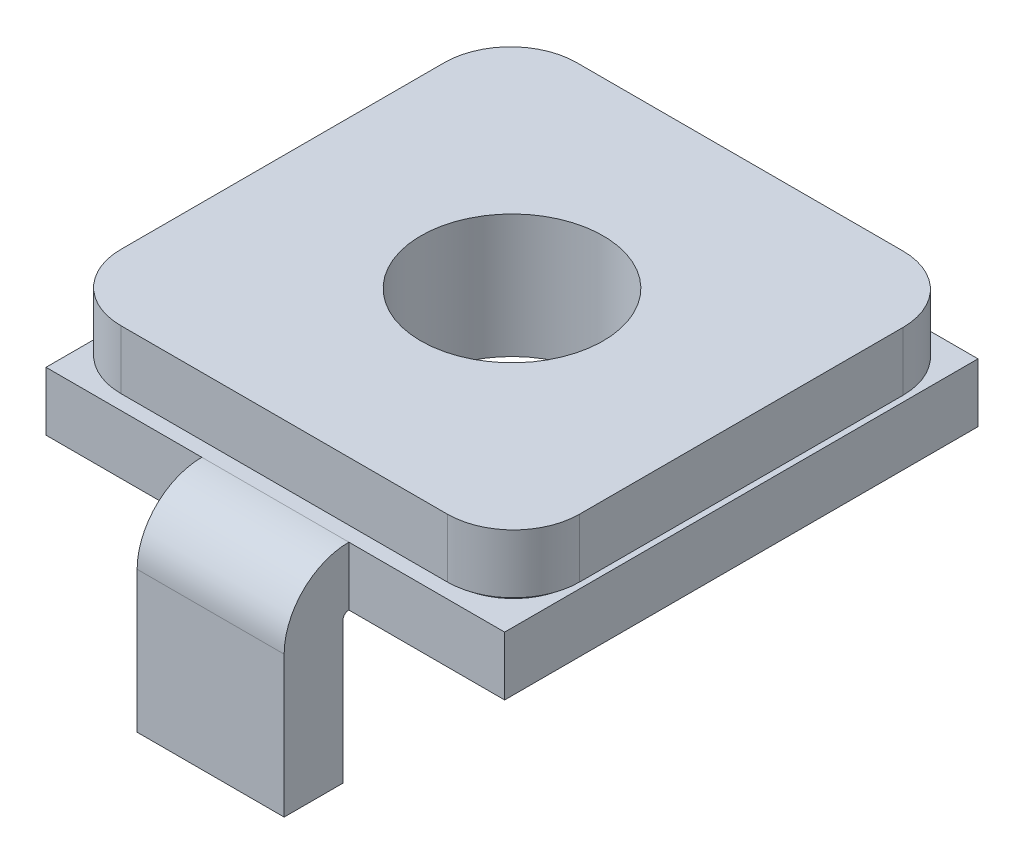
ISO-10303-21;
HEADER;
FILE_DESCRIPTION(('STEP AP214'),'2;1');
FILE_NAME('part.step','',(''),(''),'','','');
FILE_SCHEMA(('AUTOMOTIVE_DESIGN { 1 0 10303 214 1 1 1 1 }'));
ENDSEC;
DATA;
#1=APPLICATION_CONTEXT('core data for automotive mechanical design processes');
#2=APPLICATION_PROTOCOL_DEFINITION('international standard','automotive_design',2000,#1);
#3=PRODUCT_CONTEXT('',#1,'mechanical');
#4=PRODUCT('Part','Part','',(#3));
#5=PRODUCT_RELATED_PRODUCT_CATEGORY('part','',(#4));
#6=PRODUCT_DEFINITION_FORMATION('','',#4);
#7=PRODUCT_DEFINITION_CONTEXT('part definition',#1,'design');
#8=PRODUCT_DEFINITION('design','',#6,#7);
#9=PRODUCT_DEFINITION_SHAPE('','',#8);
#10=(LENGTH_UNIT() NAMED_UNIT(*) SI_UNIT(.MILLI.,.METRE.));
#11=(NAMED_UNIT(*) PLANE_ANGLE_UNIT() SI_UNIT($,.RADIAN.));
#12=(NAMED_UNIT(*) SI_UNIT($,.STERADIAN.) SOLID_ANGLE_UNIT());
#13=UNCERTAINTY_MEASURE_WITH_UNIT(LENGTH_MEASURE(1.E-05),#10,'distance_accuracy_value','');
#14=(GEOMETRIC_REPRESENTATION_CONTEXT(3) GLOBAL_UNCERTAINTY_ASSIGNED_CONTEXT((#13)) GLOBAL_UNIT_ASSIGNED_CONTEXT((#10,
#11,#12)) REPRESENTATION_CONTEXT('',''));
#15=CARTESIAN_POINT('',(0.,0.,0.));
#16=DIRECTION('',(0.,0.,1.));
#17=DIRECTION('',(1.,0.,0.));
#18=AXIS2_PLACEMENT_3D('',#15,#16,#17);
#19=CARTESIAN_POINT('',(3.9,-1.1,-4.025));
#20=DIRECTION('',(-1.,0.,0.));
#21=DIRECTION('',(0.,0.,1.));
#22=AXIS2_PLACEMENT_3D('',#19,#20,#21);
#23=CYLINDRICAL_SURFACE('',#22,0.100000000000001);
#24=CARTESIAN_POINT('',(-1.25,-1.1,-4.025));
#25=DIRECTION('',(-1.,0.,0.));
#26=DIRECTION('',(0.,0.,1.));
#27=AXIS2_PLACEMENT_3D('',#24,#25,#26);
#28=CIRCLE('',#27,0.100000000000001);
#29=CARTESIAN_POINT('',(-1.25,-1.1,-4.125));
#30=VERTEX_POINT('',#29);
#31=CARTESIAN_POINT('',(-1.25,-0.999999999999999,-4.025));
#32=VERTEX_POINT('',#31);
#33=EDGE_CURVE('E893',#30,#32,#28,.F.);
#34=ORIENTED_EDGE('',*,*,#33,.F.);
#35=DIRECTION('',(-1.,0.,0.));
#36=VECTOR('',#35,1.);
#37=CARTESIAN_POINT('',(3.9,-1.1,-4.125));
#38=LINE('',#37,#36);
#39=CARTESIAN_POINT('',(1.25,-1.1,-4.125));
#40=VERTEX_POINT('',#39);
#41=EDGE_CURVE('E269',#40,#30,#38,.T.);
#42=ORIENTED_EDGE('',*,*,#41,.F.);
#43=CARTESIAN_POINT('',(1.25,-1.1,-4.025));
#44=DIRECTION('',(1.,0.,0.));
#45=DIRECTION('',(0.,0.,-1.));
#46=AXIS2_PLACEMENT_3D('',#43,#44,#45);
#47=CIRCLE('',#46,0.100000000000001);
#48=CARTESIAN_POINT('',(1.25,-1.,-4.025));
#49=VERTEX_POINT('',#48);
#50=EDGE_CURVE('E454',#49,#40,#47,.F.);
#51=ORIENTED_EDGE('',*,*,#50,.F.);
#52=DIRECTION('',(-1.,0.,0.));
#53=VECTOR('',#52,1.);
#54=CARTESIAN_POINT('',(3.9,-0.999999999999999,-4.025));
#55=LINE('',#54,#53);
#56=EDGE_CURVE('E277',#49,#32,#55,.T.);
#57=ORIENTED_EDGE('',*,*,#56,.T.);
#58=EDGE_LOOP('',(#34,#42,#51,#57));
#59=FACE_BOUND('',#58,.T.);
#60=ADVANCED_FACE('F33',(#59),#23,.F.);
#61=CARTESIAN_POINT('',(3.9,-1.1,-4.125));
#62=DIRECTION('',(0.,0.,-1.));
#63=DIRECTION('',(-1.,0.,0.));
#64=AXIS2_PLACEMENT_3D('',#61,#62,#63);
#65=PLANE('',#64);
#66=DIRECTION('',(0.,1.,0.));
#67=VECTOR('',#66,1.);
#68=CARTESIAN_POINT('',(-1.25,-1.1,-4.125));
#69=LINE('',#68,#67);
#70=CARTESIAN_POINT('',(-1.25,-3.5,-4.125));
#71=VERTEX_POINT('',#70);
#72=EDGE_CURVE('E892',#71,#30,#69,.T.);
#73=ORIENTED_EDGE('',*,*,#72,.F.);
#74=DIRECTION('',(-1.,0.,0.));
#75=VECTOR('',#74,1.);
#76=CARTESIAN_POINT('',(3.9,-3.5,-4.125));
#77=LINE('',#76,#75);
#78=CARTESIAN_POINT('',(1.25,-3.5,-4.125));
#79=VERTEX_POINT('',#78);
#80=EDGE_CURVE('E261',#79,#71,#77,.T.);
#81=ORIENTED_EDGE('',*,*,#80,.F.);
#82=DIRECTION('',(0.,-1.,0.));
#83=VECTOR('',#82,1.);
#84=CARTESIAN_POINT('',(1.25,-1.1,-4.125));
#85=LINE('',#84,#83);
#86=EDGE_CURVE('E452',#40,#79,#85,.T.);
#87=ORIENTED_EDGE('',*,*,#86,.F.);
#88=ORIENTED_EDGE('',*,*,#41,.T.);
#89=EDGE_LOOP('',(#73,#81,#87,#88));
#90=FACE_BOUND('',#89,.T.);
#91=ADVANCED_FACE('F566',(#90),#65,.F.);
#92=CARTESIAN_POINT('',(3.9,-3.5,-4.125));
#93=DIRECTION('',(0.,1.,0.));
#94=DIRECTION('',(0.,0.,1.));
#95=AXIS2_PLACEMENT_3D('',#92,#93,#94);
#96=PLANE('',#95);
#97=DIRECTION('',(0.,0.,-1.));
#98=VECTOR('',#97,1.);
#99=CARTESIAN_POINT('',(-1.25,-3.5,-5.125));
#100=LINE('',#99,#98);
#101=CARTESIAN_POINT('',(-1.25,-3.5,-5.125));
#102=VERTEX_POINT('',#101);
#103=EDGE_CURVE('E244',#71,#102,#100,.T.);
#104=ORIENTED_EDGE('',*,*,#103,.T.);
#105=DIRECTION('',(-1.,0.,0.));
#106=VECTOR('',#105,1.);
#107=CARTESIAN_POINT('',(3.9,-3.5,-5.125));
#108=LINE('',#107,#106);
#109=CARTESIAN_POINT('',(1.25,-3.5,-5.125));
#110=VERTEX_POINT('',#109);
#111=EDGE_CURVE('E259',#110,#102,#108,.T.);
#112=ORIENTED_EDGE('',*,*,#111,.F.);
#113=DIRECTION('',(0.,0.,1.));
#114=VECTOR('',#113,1.);
#115=CARTESIAN_POINT('',(1.25,-3.5,-5.125));
#116=LINE('',#115,#114);
#117=EDGE_CURVE('E451',#110,#79,#116,.T.);
#118=ORIENTED_EDGE('',*,*,#117,.T.);
#119=ORIENTED_EDGE('',*,*,#80,.T.);
#120=EDGE_LOOP('',(#104,#112,#118,#119));
#121=FACE_BOUND('',#120,.T.);
#122=ADVANCED_FACE('F257',(#121),#96,.F.);
#123=CARTESIAN_POINT('',(3.9,-1.1,-5.125));
#124=DIRECTION('',(0.,0.,1.));
#125=DIRECTION('',(1.,0.,0.));
#126=AXIS2_PLACEMENT_3D('',#123,#124,#125);
#127=PLANE('',#126);
#128=DIRECTION('',(0.,-1.,0.));
#129=VECTOR('',#128,1.);
#130=CARTESIAN_POINT('',(-1.25,1.1,-5.12500000000001));
#131=LINE('',#130,#129);
#132=CARTESIAN_POINT('',(-1.25,-1.1,-5.12500000000001));
#133=VERTEX_POINT('',#132);
#134=EDGE_CURVE('E241',#133,#102,#131,.T.);
#135=ORIENTED_EDGE('',*,*,#134,.F.);
#136=DIRECTION('',(-1.,0.,0.));
#137=VECTOR('',#136,1.);
#138=CARTESIAN_POINT('',(3.9,-1.1,-5.125));
#139=LINE('',#138,#137);
#140=CARTESIAN_POINT('',(1.25,-1.1,-5.12500000000001));
#141=VERTEX_POINT('',#140);
#142=EDGE_CURVE('E267',#141,#133,#139,.T.);
#143=ORIENTED_EDGE('',*,*,#142,.F.);
#144=DIRECTION('',(0.,-1.,0.));
#145=VECTOR('',#144,1.);
#146=CARTESIAN_POINT('',(1.25,1.1,-5.12500000000001));
#147=LINE('',#146,#145);
#148=EDGE_CURVE('E266',#141,#110,#147,.T.);
#149=ORIENTED_EDGE('',*,*,#148,.T.);
#150=ORIENTED_EDGE('',*,*,#111,.T.);
#151=EDGE_LOOP('',(#135,#143,#149,#150));
#152=FACE_BOUND('',#151,.T.);
#153=ADVANCED_FACE('F265',(#152),#127,.F.);
#154=CARTESIAN_POINT('',(3.9,-1.1,-4.025));
#155=DIRECTION('',(-1.,0.,0.));
#156=DIRECTION('',(0.,0.,1.));
#157=AXIS2_PLACEMENT_3D('',#154,#155,#156);
#158=CYLINDRICAL_SURFACE('',#157,1.1);
#159=CARTESIAN_POINT('',(-1.25,-1.1,-4.025));
#160=DIRECTION('',(-1.,0.,0.));
#161=DIRECTION('',(0.,0.,1.));
#162=AXIS2_PLACEMENT_3D('',#159,#160,#161);
#163=CIRCLE('',#162,1.1);
#164=CARTESIAN_POINT('',(-1.25,0.,-4.025));
#165=VERTEX_POINT('',#164);
#166=EDGE_CURVE('E11',#165,#133,#163,.T.);
#167=ORIENTED_EDGE('',*,*,#166,.F.);
#168=DIRECTION('',(-1.,0.,0.));
#169=VECTOR('',#168,1.);
#170=CARTESIAN_POINT('',(3.9,0.,-4.025));
#171=LINE('',#170,#169);
#172=CARTESIAN_POINT('',(1.25,0.,-4.025));
#173=VERTEX_POINT('',#172);
#174=EDGE_CURVE('E437',#173,#165,#171,.T.);
#175=ORIENTED_EDGE('',*,*,#174,.F.);
#176=CARTESIAN_POINT('',(1.25,-1.1,-4.025));
#177=DIRECTION('',(1.,0.,0.));
#178=DIRECTION('',(0.,0.,-1.));
#179=AXIS2_PLACEMENT_3D('',#176,#177,#178);
#180=CIRCLE('',#179,1.1);
#181=EDGE_CURVE('E366',#141,#173,#180,.T.);
#182=ORIENTED_EDGE('',*,*,#181,.F.);
#183=ORIENTED_EDGE('',*,*,#142,.T.);
#184=EDGE_LOOP('',(#167,#175,#182,#183));
#185=FACE_BOUND('',#184,.T.);
#186=ADVANCED_FACE('F447',(#185),#158,.T.);
#187=CARTESIAN_POINT('',(-3.9,-1.1,4.025));
#188=DIRECTION('',(-1.,0.,0.));
#189=DIRECTION('',(0.,0.,1.));
#190=AXIS2_PLACEMENT_3D('',#187,#188,#189);
#191=PLANE('',#190);
#192=DIRECTION('',(0.,0.,1.));
#193=VECTOR('',#192,1.);
#194=CARTESIAN_POINT('',(-3.9,0.,4.025));
#195=LINE('',#194,#193);
#196=CARTESIAN_POINT('',(-3.9,0.,-4.025));
#197=VERTEX_POINT('',#196);
#198=CARTESIAN_POINT('',(-3.9,0.,4.025));
#199=VERTEX_POINT('',#198);
#200=EDGE_CURVE('E376',#197,#199,#195,.T.);
#201=ORIENTED_EDGE('',*,*,#200,.F.);
#202=DIRECTION('',(0.,-1.,0.));
#203=VECTOR('',#202,1.);
#204=CARTESIAN_POINT('',(-3.9,-1.10000000000001,-4.025));
#205=LINE('',#204,#203);
#206=CARTESIAN_POINT('',(-3.9,-0.999999999999999,-4.025));
#207=VERTEX_POINT('',#206);
#208=EDGE_CURVE('E41',#197,#207,#205,.T.);
#209=ORIENTED_EDGE('',*,*,#208,.T.);
#210=DIRECTION('',(0.,0.,-1.));
#211=VECTOR('',#210,1.);
#212=CARTESIAN_POINT('',(-3.9,-1.,4.025));
#213=LINE('',#212,#211);
#214=CARTESIAN_POINT('',(-3.9,-1.,4.025));
#215=VERTEX_POINT('',#214);
#216=EDGE_CURVE('E374',#215,#207,#213,.T.);
#217=ORIENTED_EDGE('',*,*,#216,.F.);
#218=DIRECTION('',(0.,-1.,0.));
#219=VECTOR('',#218,1.);
#220=CARTESIAN_POINT('',(-3.9,-1.1,4.025));
#221=LINE('',#220,#219);
#222=EDGE_CURVE('E364',#199,#215,#221,.T.);
#223=ORIENTED_EDGE('',*,*,#222,.F.);
#224=EDGE_LOOP('',(#201,#209,#217,#223));
#225=FACE_BOUND('',#224,.T.);
#226=ADVANCED_FACE('F372',(#225),#191,.T.);
#227=CARTESIAN_POINT('',(3.9,-1.1,4.025));
#228=DIRECTION('',(-1.,0.,0.));
#229=DIRECTION('',(0.,0.,1.));
#230=AXIS2_PLACEMENT_3D('',#227,#228,#229);
#231=PLANE('',#230);
#232=DIRECTION('',(0.,-1.,0.));
#233=VECTOR('',#232,1.);
#234=CARTESIAN_POINT('',(3.9,1.1,-4.025));
#235=LINE('',#234,#233);
#236=CARTESIAN_POINT('',(3.9,0.,-4.025));
#237=VERTEX_POINT('',#236);
#238=CARTESIAN_POINT('',(3.9,-1.,-4.025));
#239=VERTEX_POINT('',#238);
#240=EDGE_CURVE('E456',#237,#239,#235,.T.);
#241=ORIENTED_EDGE('',*,*,#240,.F.);
#242=DIRECTION('',(0.,0.,1.));
#243=VECTOR('',#242,1.);
#244=CARTESIAN_POINT('',(3.9,0.,-3.75));
#245=LINE('',#244,#243);
#246=CARTESIAN_POINT('',(3.9,0.,4.025));
#247=VERTEX_POINT('',#246);
#248=EDGE_CURVE('E509',#237,#247,#245,.T.);
#249=ORIENTED_EDGE('',*,*,#248,.T.);
#250=DIRECTION('',(0.,-1.,0.));
#251=VECTOR('',#250,1.);
#252=CARTESIAN_POINT('',(3.9,1.1,4.025));
#253=LINE('',#252,#251);
#254=CARTESIAN_POINT('',(3.9,-1.,4.025));
#255=VERTEX_POINT('',#254);
#256=EDGE_CURVE('E487',#247,#255,#253,.T.);
#257=ORIENTED_EDGE('',*,*,#256,.T.);
#258=DIRECTION('',(0.,0.,-1.));
#259=VECTOR('',#258,1.);
#260=CARTESIAN_POINT('',(3.9,-1.,4.025));
#261=LINE('',#260,#259);
#262=EDGE_CURVE('E404',#255,#239,#261,.T.);
#263=ORIENTED_EDGE('',*,*,#262,.T.);
#264=EDGE_LOOP('',(#241,#249,#257,#263));
#265=FACE_BOUND('',#264,.T.);
#266=ADVANCED_FACE('F642',(#265),#231,.F.);
#267=DIRECTION('',(0.,0.,1.));
#268=VECTOR('',#267,1.);
#269=CARTESIAN_POINT('',(-3.9,1.1,3.875));
#270=LINE('',#269,#268);
#271=CARTESIAN_POINT('',(-3.9,1.1,-2.75));
#272=VERTEX_POINT('',#271);
#273=CARTESIAN_POINT('',(-3.9,1.1,2.75));
#274=VERTEX_POINT('',#273);
#275=EDGE_CURVE('E388',#272,#274,#270,.T.);
#276=ORIENTED_EDGE('',*,*,#275,.F.);
#277=DIRECTION('',(0.,1.,0.));
#278=VECTOR('',#277,1.);
#279=CARTESIAN_POINT('',(-3.9,0.1,-2.75));
#280=LINE('',#279,#278);
#281=CARTESIAN_POINT('',(-3.9,0.0999999999999997,-2.75));
#282=VERTEX_POINT('',#281);
#283=EDGE_CURVE('E341',#272,#282,#280,.F.);
#284=ORIENTED_EDGE('',*,*,#283,.T.);
#285=DIRECTION('',(0.,0.,-1.));
#286=VECTOR('',#285,1.);
#287=CARTESIAN_POINT('',(-3.9,0.099999999999999,3.75));
#288=LINE('',#287,#286);
#289=CARTESIAN_POINT('',(-3.9,0.0999999999999991,2.75));
#290=VERTEX_POINT('',#289);
#291=EDGE_CURVE('E392',#290,#282,#288,.T.);
#292=ORIENTED_EDGE('',*,*,#291,.F.);
#293=DIRECTION('',(0.,-1.,0.));
#294=VECTOR('',#293,1.);
#295=CARTESIAN_POINT('',(-3.9,1.1,2.75));
#296=LINE('',#295,#294);
#297=EDGE_CURVE('E339',#290,#274,#296,.F.);
#298=ORIENTED_EDGE('',*,*,#297,.T.);
#299=EDGE_LOOP('',(#276,#284,#292,#298));
#300=FACE_BOUND('',#299,.T.);
#301=ADVANCED_FACE('F541',(#300),#191,.T.);
#302=CARTESIAN_POINT('',(3.9,-3.5,5.125));
#303=DIRECTION('',(0.,1.,0.));
#304=DIRECTION('',(0.,0.,1.));
#305=AXIS2_PLACEMENT_3D('',#302,#303,#304);
#306=PLANE('',#305);
#307=DIRECTION('',(-1.,0.,0.));
#308=VECTOR('',#307,1.);
#309=CARTESIAN_POINT('',(3.9,-3.5,5.125));
#310=LINE('',#309,#308);
#311=CARTESIAN_POINT('',(1.25,-3.5,5.125));
#312=VERTEX_POINT('',#311);
#313=CARTESIAN_POINT('',(-1.25,-3.5,5.125));
#314=VERTEX_POINT('',#313);
#315=EDGE_CURVE('E405',#312,#314,#310,.T.);
#316=ORIENTED_EDGE('',*,*,#315,.T.);
#317=DIRECTION('',(0.,0.,1.));
#318=VECTOR('',#317,1.);
#319=CARTESIAN_POINT('',(-1.25,-3.5,5.125));
#320=LINE('',#319,#318);
#321=CARTESIAN_POINT('',(-1.25,-3.5,4.125));
#322=VERTEX_POINT('',#321);
#323=EDGE_CURVE('E463',#322,#314,#320,.T.);
#324=ORIENTED_EDGE('',*,*,#323,.F.);
#325=DIRECTION('',(-1.,0.,0.));
#326=VECTOR('',#325,1.);
#327=CARTESIAN_POINT('',(3.9,-3.5,4.125));
#328=LINE('',#327,#326);
#329=CARTESIAN_POINT('',(1.25,-3.5,4.125));
#330=VERTEX_POINT('',#329);
#331=EDGE_CURVE('E287',#330,#322,#328,.T.);
#332=ORIENTED_EDGE('',*,*,#331,.F.);
#333=DIRECTION('',(0.,0.,-1.));
#334=VECTOR('',#333,1.);
#335=CARTESIAN_POINT('',(1.25,-3.5,5.125));
#336=LINE('',#335,#334);
#337=EDGE_CURVE('E484',#312,#330,#336,.T.);
#338=ORIENTED_EDGE('',*,*,#337,.F.);
#339=EDGE_LOOP('',(#316,#324,#332,#338));
#340=FACE_BOUND('',#339,.T.);
#341=ADVANCED_FACE('F587',(#340),#306,.F.);
#342=CARTESIAN_POINT('',(3.9,-3.5,4.125));
#343=DIRECTION('',(0.,0.,1.));
#344=DIRECTION('',(1.,0.,0.));
#345=AXIS2_PLACEMENT_3D('',#342,#343,#344);
#346=PLANE('',#345);
#347=ORIENTED_EDGE('',*,*,#331,.T.);
#348=DIRECTION('',(0.,1.,0.));
#349=VECTOR('',#348,1.);
#350=CARTESIAN_POINT('',(-1.25,-3.5,4.125));
#351=LINE('',#350,#349);
#352=CARTESIAN_POINT('',(-1.25,-1.1,4.125));
#353=VERTEX_POINT('',#352);
#354=EDGE_CURVE('E481',#322,#353,#351,.T.);
#355=ORIENTED_EDGE('',*,*,#354,.T.);
#356=DIRECTION('',(-1.,0.,0.));
#357=VECTOR('',#356,1.);
#358=CARTESIAN_POINT('',(3.9,-1.1,4.125));
#359=LINE('',#358,#357);
#360=CARTESIAN_POINT('',(1.25,-1.1,4.125));
#361=VERTEX_POINT('',#360);
#362=EDGE_CURVE('E284',#361,#353,#359,.T.);
#363=ORIENTED_EDGE('',*,*,#362,.F.);
#364=DIRECTION('',(0.,-1.,0.));
#365=VECTOR('',#364,1.);
#366=CARTESIAN_POINT('',(1.25,-3.5,4.125));
#367=LINE('',#366,#365);
#368=EDGE_CURVE('E496',#361,#330,#367,.T.);
#369=ORIENTED_EDGE('',*,*,#368,.T.);
#370=EDGE_LOOP('',(#347,#355,#363,#369));
#371=FACE_BOUND('',#370,.T.);
#372=ADVANCED_FACE('F583',(#371),#346,.F.);
#373=CARTESIAN_POINT('',(3.9,-1.1,4.025));
#374=DIRECTION('',(-1.,0.,0.));
#375=DIRECTION('',(0.,0.,1.));
#376=AXIS2_PLACEMENT_3D('',#373,#374,#375);
#377=CYLINDRICAL_SURFACE('',#376,0.1);
#378=ORIENTED_EDGE('',*,*,#362,.T.);
#379=CARTESIAN_POINT('',(-1.25,-1.1,4.025));
#380=DIRECTION('',(1.,0.,0.));
#381=DIRECTION('',(0.,0.,-1.));
#382=AXIS2_PLACEMENT_3D('',#379,#380,#381);
#383=CIRCLE('',#382,0.1);
#384=CARTESIAN_POINT('',(-1.25,-1.,4.025));
#385=VERTEX_POINT('',#384);
#386=EDGE_CURVE('E478',#353,#385,#383,.F.);
#387=ORIENTED_EDGE('',*,*,#386,.T.);
#388=DIRECTION('',(-1.,0.,0.));
#389=VECTOR('',#388,1.);
#390=CARTESIAN_POINT('',(3.9,-1.,4.025));
#391=LINE('',#390,#389);
#392=CARTESIAN_POINT('',(1.25,-1.,4.025));
#393=VERTEX_POINT('',#392);
#394=EDGE_CURVE('E280',#393,#385,#391,.T.);
#395=ORIENTED_EDGE('',*,*,#394,.F.);
#396=CARTESIAN_POINT('',(1.25,-1.1,4.025));
#397=DIRECTION('',(-1.,0.,0.));
#398=DIRECTION('',(0.,0.,1.));
#399=AXIS2_PLACEMENT_3D('',#396,#397,#398);
#400=CIRCLE('',#399,0.1);
#401=EDGE_CURVE('E493',#393,#361,#400,.F.);
#402=ORIENTED_EDGE('',*,*,#401,.T.);
#403=EDGE_LOOP('',(#378,#387,#395,#402));
#404=FACE_BOUND('',#403,.T.);
#405=ADVANCED_FACE('F579',(#404),#377,.F.);
#406=CARTESIAN_POINT('',(3.9,-1.,4.025));
#407=DIRECTION('',(0.,1.,0.));
#408=DIRECTION('',(0.,0.,1.));
#409=AXIS2_PLACEMENT_3D('',#406,#407,#408);
#410=PLANE('',#409);
#411=CARTESIAN_POINT('',(0.,-1.,0.));
#412=DIRECTION('',(0.,1.,0.));
#413=DIRECTION('',(0.,0.,1.));
#414=AXIS2_PLACEMENT_3D('',#411,#412,#413);
#415=CIRCLE('',#414,1.55);
#416=CARTESIAN_POINT('',(0.,-1.,1.55));
#417=VERTEX_POINT('',#416);
#418=EDGE_CURVE('E262',#417,#417,#415,.T.);
#419=ORIENTED_EDGE('',*,*,#418,.T.);
#420=EDGE_LOOP('',(#419));
#421=FACE_BOUND('',#420,.T.);
#422=ORIENTED_EDGE('',*,*,#216,.T.);
#423=DIRECTION('',(-1.,0.,0.));
#424=VECTOR('',#423,1.);
#425=CARTESIAN_POINT('',(3.9,-0.999999999999999,-4.025));
#426=LINE('',#425,#424);
#427=EDGE_CURVE('E384',#32,#207,#426,.T.);
#428=ORIENTED_EDGE('',*,*,#427,.F.);
#429=ORIENTED_EDGE('',*,*,#56,.F.);
#430=EDGE_CURVE('E278',#239,#49,#55,.T.);
#431=ORIENTED_EDGE('',*,*,#430,.F.);
#432=ORIENTED_EDGE('',*,*,#262,.F.);
#433=EDGE_CURVE('E281',#255,#393,#391,.T.);
#434=ORIENTED_EDGE('',*,*,#433,.T.);
#435=ORIENTED_EDGE('',*,*,#394,.T.);
#436=DIRECTION('',(-1.,0.,0.));
#437=VECTOR('',#436,1.);
#438=CARTESIAN_POINT('',(3.9,-1.,4.025));
#439=LINE('',#438,#437);
#440=EDGE_CURVE('E387',#385,#215,#439,.T.);
#441=ORIENTED_EDGE('',*,*,#440,.T.);
#442=EDGE_LOOP('',(#422,#428,#429,#431,#432,#434,#435,#441));
#443=FACE_BOUND('',#442,.T.);
#444=ADVANCED_FACE('F382',(#421,#443),#410,.F.);
#445=CARTESIAN_POINT('',(3.9,0.1,-3.75));
#446=DIRECTION('',(0.,0.,1.));
#447=DIRECTION('',(1.,0.,0.));
#448=AXIS2_PLACEMENT_3D('',#445,#446,#447);
#449=PLANE('',#448);
#450=DIRECTION('',(-1.,0.,0.));
#451=VECTOR('',#450,1.);
#452=CARTESIAN_POINT('',(3.9,0.1,-3.75));
#453=LINE('',#452,#451);
#454=CARTESIAN_POINT('',(2.775,0.1,-3.75));
#455=VERTEX_POINT('',#454);
#456=CARTESIAN_POINT('',(-2.775,0.1,-3.75));
#457=VERTEX_POINT('',#456);
#458=EDGE_CURVE('E432',#455,#457,#453,.T.);
#459=ORIENTED_EDGE('',*,*,#458,.F.);
#460=DIRECTION('',(0.,-1.,0.));
#461=VECTOR('',#460,1.);
#462=CARTESIAN_POINT('',(2.775,0.1,-3.75));
#463=LINE('',#462,#461);
#464=CARTESIAN_POINT('',(2.775,0.,-3.75));
#465=VERTEX_POINT('',#464);
#466=EDGE_CURVE('E293',#455,#465,#463,.T.);
#467=ORIENTED_EDGE('',*,*,#466,.T.);
#468=DIRECTION('',(-1.,0.,0.));
#469=VECTOR('',#468,1.);
#470=CARTESIAN_POINT('',(3.9,0.,-3.75));
#471=LINE('',#470,#469);
#472=CARTESIAN_POINT('',(-2.775,0.,-3.75));
#473=VERTEX_POINT('',#472);
#474=EDGE_CURVE('E435',#465,#473,#471,.T.);
#475=ORIENTED_EDGE('',*,*,#474,.T.);
#476=DIRECTION('',(0.,1.,0.));
#477=VECTOR('',#476,1.);
#478=CARTESIAN_POINT('',(-2.775,0.1,-3.75));
#479=LINE('',#478,#477);
#480=EDGE_CURVE('E290',#473,#457,#479,.T.);
#481=ORIENTED_EDGE('',*,*,#480,.T.);
#482=EDGE_LOOP('',(#459,#467,#475,#481));
#483=FACE_BOUND('',#482,.T.);
#484=ADVANCED_FACE('F562',(#483),#449,.F.);
#485=CARTESIAN_POINT('',(3.9,1.1,-3.875));
#486=DIRECTION('',(0.,0.,1.));
#487=DIRECTION('',(1.,0.,0.));
#488=AXIS2_PLACEMENT_3D('',#485,#486,#487);
#489=PLANE('',#488);
#490=DIRECTION('',(-1.,0.,0.));
#491=VECTOR('',#490,1.);
#492=CARTESIAN_POINT('',(3.9,0.1,-3.875));
#493=LINE('',#492,#491);
#494=CARTESIAN_POINT('',(2.775,0.1,-3.875));
#495=VERTEX_POINT('',#494);
#496=CARTESIAN_POINT('',(-2.775,0.1,-3.875));
#497=VERTEX_POINT('',#496);
#498=EDGE_CURVE('E429',#495,#497,#493,.T.);
#499=ORIENTED_EDGE('',*,*,#498,.T.);
#500=DIRECTION('',(0.,1.,0.));
#501=VECTOR('',#500,1.);
#502=CARTESIAN_POINT('',(-2.775,1.1,-3.875));
#503=LINE('',#502,#501);
#504=CARTESIAN_POINT('',(-2.775,1.1,-3.875));
#505=VERTEX_POINT('',#504);
#506=EDGE_CURVE('E328',#497,#505,#503,.T.);
#507=ORIENTED_EDGE('',*,*,#506,.T.);
#508=DIRECTION('',(-1.,0.,0.));
#509=VECTOR('',#508,1.);
#510=CARTESIAN_POINT('',(3.9,1.1,-3.875));
#511=LINE('',#510,#509);
#512=CARTESIAN_POINT('',(2.775,1.1,-3.875));
#513=VERTEX_POINT('',#512);
#514=EDGE_CURVE('E426',#513,#505,#511,.T.);
#515=ORIENTED_EDGE('',*,*,#514,.F.);
#516=DIRECTION('',(0.,1.,0.));
#517=VECTOR('',#516,1.);
#518=CARTESIAN_POINT('',(2.775,1.1,-3.875));
#519=LINE('',#518,#517);
#520=EDGE_CURVE('E326',#513,#495,#519,.F.);
#521=ORIENTED_EDGE('',*,*,#520,.T.);
#522=EDGE_LOOP('',(#499,#507,#515,#521));
#523=FACE_BOUND('',#522,.T.);
#524=ADVANCED_FACE('F549',(#523),#489,.F.);
#525=CARTESIAN_POINT('',(3.9,1.1,3.875));
#526=DIRECTION('',(0.,-1.,0.));
#527=DIRECTION('',(0.,0.,-1.));
#528=AXIS2_PLACEMENT_3D('',#525,#526,#527);
#529=PLANE('',#528);
#530=CARTESIAN_POINT('',(0.,1.1,0.));
#531=DIRECTION('',(0.,1.,0.));
#532=DIRECTION('',(0.,0.,1.));
#533=AXIS2_PLACEMENT_3D('',#530,#531,#532);
#534=CIRCLE('',#533,1.55);
#535=CARTESIAN_POINT('',(0.,1.1,1.55));
#536=VERTEX_POINT('',#535);
#537=EDGE_CURVE('E882',#536,#536,#534,.T.);
#538=ORIENTED_EDGE('',*,*,#537,.F.);
#539=EDGE_LOOP('',(#538));
#540=FACE_BOUND('',#539,.T.);
#541=ORIENTED_EDGE('',*,*,#514,.T.);
#542=CARTESIAN_POINT('',(-2.775,1.1,-2.75));
#543=DIRECTION('',(0.,-1.,0.));
#544=DIRECTION('',(0.,0.,-1.));
#545=AXIS2_PLACEMENT_3D('',#542,#543,#544);
#546=CIRCLE('',#545,1.125);
#547=EDGE_CURVE('E337',#505,#272,#546,.F.);
#548=ORIENTED_EDGE('',*,*,#547,.T.);
#549=ORIENTED_EDGE('',*,*,#275,.T.);
#550=CARTESIAN_POINT('',(-2.775,1.1,2.75));
#551=DIRECTION('',(0.,-1.,0.));
#552=DIRECTION('',(0.,0.,-1.));
#553=AXIS2_PLACEMENT_3D('',#550,#551,#552);
#554=CIRCLE('',#553,1.125);
#555=CARTESIAN_POINT('',(-2.775,1.1,3.875));
#556=VERTEX_POINT('',#555);
#557=EDGE_CURVE('E335',#274,#556,#554,.F.);
#558=ORIENTED_EDGE('',*,*,#557,.T.);
#559=DIRECTION('',(-1.,0.,0.));
#560=VECTOR('',#559,1.);
#561=CARTESIAN_POINT('',(3.9,1.1,3.875));
#562=LINE('',#561,#560);
#563=CARTESIAN_POINT('',(2.775,1.1,3.875));
#564=VERTEX_POINT('',#563);
#565=EDGE_CURVE('E423',#564,#556,#562,.T.);
#566=ORIENTED_EDGE('',*,*,#565,.F.);
#567=CARTESIAN_POINT('',(2.775,1.1,2.75));
#568=DIRECTION('',(0.,-1.,0.));
#569=DIRECTION('',(0.,0.,-1.));
#570=AXIS2_PLACEMENT_3D('',#567,#568,#569);
#571=CIRCLE('',#570,1.125);
#572=CARTESIAN_POINT('',(3.9,1.1,2.75));
#573=VERTEX_POINT('',#572);
#574=EDGE_CURVE('E333',#564,#573,#571,.F.);
#575=ORIENTED_EDGE('',*,*,#574,.T.);
#576=DIRECTION('',(0.,0.,1.));
#577=VECTOR('',#576,1.);
#578=CARTESIAN_POINT('',(3.9,1.1,3.875));
#579=LINE('',#578,#577);
#580=CARTESIAN_POINT('',(3.9,1.1,-2.75));
#581=VERTEX_POINT('',#580);
#582=EDGE_CURVE('E398',#581,#573,#579,.T.);
#583=ORIENTED_EDGE('',*,*,#582,.F.);
#584=CARTESIAN_POINT('',(2.775,1.1,-2.75));
#585=DIRECTION('',(0.,-1.,0.));
#586=DIRECTION('',(0.,0.,-1.));
#587=AXIS2_PLACEMENT_3D('',#584,#585,#586);
#588=CIRCLE('',#587,1.125);
#589=EDGE_CURVE('E331',#581,#513,#588,.F.);
#590=ORIENTED_EDGE('',*,*,#589,.T.);
#591=EDGE_LOOP('',(#541,#548,#549,#558,#566,#575,#583,#590));
#592=FACE_BOUND('',#591,.T.);
#593=ADVANCED_FACE('F553',(#540,#592),#529,.F.);
#594=CARTESIAN_POINT('',(3.9,0.099999999999999,3.875));
#595=DIRECTION('',(0.,0.,-1.));
#596=DIRECTION('',(-1.,0.,0.));
#597=AXIS2_PLACEMENT_3D('',#594,#595,#596);
#598=PLANE('',#597);
#599=ORIENTED_EDGE('',*,*,#565,.T.);
#600=DIRECTION('',(0.,-1.,0.));
#601=VECTOR('',#600,1.);
#602=CARTESIAN_POINT('',(-2.775,0.099999999999999,3.875));
#603=LINE('',#602,#601);
#604=CARTESIAN_POINT('',(-2.775,0.099999999999999,3.875));
#605=VERTEX_POINT('',#604);
#606=EDGE_CURVE('E353',#556,#605,#603,.T.);
#607=ORIENTED_EDGE('',*,*,#606,.T.);
#608=DIRECTION('',(-1.,0.,0.));
#609=VECTOR('',#608,1.);
#610=CARTESIAN_POINT('',(3.9,0.099999999999999,3.875));
#611=LINE('',#610,#609);
#612=CARTESIAN_POINT('',(2.775,0.099999999999999,3.875));
#613=VERTEX_POINT('',#612);
#614=EDGE_CURVE('E420',#613,#605,#611,.T.);
#615=ORIENTED_EDGE('',*,*,#614,.F.);
#616=DIRECTION('',(0.,-1.,0.));
#617=VECTOR('',#616,1.);
#618=CARTESIAN_POINT('',(2.775,0.099999999999999,3.875));
#619=LINE('',#618,#617);
#620=EDGE_CURVE('E351',#613,#564,#619,.F.);
#621=ORIENTED_EDGE('',*,*,#620,.T.);
#622=EDGE_LOOP('',(#599,#607,#615,#621));
#623=FACE_BOUND('',#622,.T.);
#624=ADVANCED_FACE('F530',(#623),#598,.F.);
#625=CARTESIAN_POINT('',(3.9,0.099999999999999,3.75));
#626=DIRECTION('',(0.,1.,0.));
#627=DIRECTION('',(0.,0.,1.));
#628=AXIS2_PLACEMENT_3D('',#625,#626,#627);
#629=PLANE('',#628);
#630=ORIENTED_EDGE('',*,*,#291,.T.);
#631=CARTESIAN_POINT('',(-2.775,0.0999999999999996,-2.75));
#632=DIRECTION('',(0.,1.,0.));
#633=DIRECTION('',(0.,0.,1.));
#634=AXIS2_PLACEMENT_3D('',#631,#632,#633);
#635=CIRCLE('',#634,1.125);
#636=EDGE_CURVE('E349',#282,#497,#635,.F.);
#637=ORIENTED_EDGE('',*,*,#636,.T.);
#638=ORIENTED_EDGE('',*,*,#498,.F.);
#639=CARTESIAN_POINT('',(2.775,0.0999999999999996,-2.75));
#640=DIRECTION('',(0.,1.,0.));
#641=DIRECTION('',(0.,0.,1.));
#642=AXIS2_PLACEMENT_3D('',#639,#640,#641);
#643=CIRCLE('',#642,1.125);
#644=CARTESIAN_POINT('',(3.9,0.0999999999999999,-2.75));
#645=VERTEX_POINT('',#644);
#646=EDGE_CURVE('E343',#495,#645,#643,.F.);
#647=ORIENTED_EDGE('',*,*,#646,.T.);
#648=DIRECTION('',(0.,0.,-1.));
#649=VECTOR('',#648,1.);
#650=CARTESIAN_POINT('',(3.9,0.1,-3.875));
#651=LINE('',#650,#649);
#652=CARTESIAN_POINT('',(3.9,0.0999999999999993,2.75));
#653=VERTEX_POINT('',#652);
#654=EDGE_CURVE('E511',#653,#645,#651,.T.);
#655=ORIENTED_EDGE('',*,*,#654,.F.);
#656=CARTESIAN_POINT('',(2.775,0.099999999999999,2.75));
#657=DIRECTION('',(0.,1.,0.));
#658=DIRECTION('',(0.,0.,1.));
#659=AXIS2_PLACEMENT_3D('',#656,#657,#658);
#660=CIRCLE('',#659,1.125);
#661=EDGE_CURVE('E345',#653,#613,#660,.F.);
#662=ORIENTED_EDGE('',*,*,#661,.T.);
#663=ORIENTED_EDGE('',*,*,#614,.T.);
#664=CARTESIAN_POINT('',(-2.775,0.0999999999999991,2.75));
#665=DIRECTION('',(0.,1.,0.));
#666=DIRECTION('',(0.,0.,1.));
#667=AXIS2_PLACEMENT_3D('',#664,#665,#666);
#668=CIRCLE('',#667,1.125);
#669=EDGE_CURVE('E347',#605,#290,#668,.F.);
#670=ORIENTED_EDGE('',*,*,#669,.T.);
#671=EDGE_LOOP('',(#630,#637,#638,#647,#655,#662,#663,#670));
#672=FACE_BOUND('',#671,.T.);
#673=DIRECTION('',(0.,0.,1.));
#674=VECTOR('',#673,1.);
#675=CARTESIAN_POINT('',(3.775,0.099999999999999,-5.125));
#676=LINE('',#675,#674);
#677=CARTESIAN_POINT('',(3.775,0.099999999999999,-2.75));
#678=VERTEX_POINT('',#677);
#679=CARTESIAN_POINT('',(3.775,0.099999999999999,2.75));
#680=VERTEX_POINT('',#679);
#681=EDGE_CURVE('E395',#678,#680,#676,.T.);
#682=ORIENTED_EDGE('',*,*,#681,.F.);
#683=CARTESIAN_POINT('',(2.775,0.0999999999999997,-2.75));
#684=DIRECTION('',(0.,1.,0.));
#685=DIRECTION('',(0.,0.,1.));
#686=AXIS2_PLACEMENT_3D('',#683,#684,#685);
#687=CIRCLE('',#686,1.);
#688=EDGE_CURVE('E312',#678,#455,#687,.T.);
#689=ORIENTED_EDGE('',*,*,#688,.T.);
#690=ORIENTED_EDGE('',*,*,#458,.T.);
#691=CARTESIAN_POINT('',(-2.775,0.0999999999999997,-2.75));
#692=DIRECTION('',(0.,1.,0.));
#693=DIRECTION('',(0.,0.,1.));
#694=AXIS2_PLACEMENT_3D('',#691,#692,#693);
#695=CIRCLE('',#694,1.);
#696=CARTESIAN_POINT('',(-3.775,0.099999999999999,-2.75));
#697=VERTEX_POINT('',#696);
#698=EDGE_CURVE('E314',#457,#697,#695,.T.);
#699=ORIENTED_EDGE('',*,*,#698,.T.);
#700=DIRECTION('',(0.,0.,1.));
#701=VECTOR('',#700,1.);
#702=CARTESIAN_POINT('',(-3.775,0.099999999999999,-5.125));
#703=LINE('',#702,#701);
#704=CARTESIAN_POINT('',(-3.775,0.099999999999999,2.75));
#705=VERTEX_POINT('',#704);
#706=EDGE_CURVE('E500',#697,#705,#703,.T.);
#707=ORIENTED_EDGE('',*,*,#706,.T.);
#708=CARTESIAN_POINT('',(-2.775,0.0999999999999991,2.75));
#709=DIRECTION('',(0.,1.,0.));
#710=DIRECTION('',(0.,0.,1.));
#711=AXIS2_PLACEMENT_3D('',#708,#709,#710);
#712=CIRCLE('',#711,1.);
#713=CARTESIAN_POINT('',(-2.775,0.099999999999999,3.75));
#714=VERTEX_POINT('',#713);
#715=EDGE_CURVE('E318',#705,#714,#712,.T.);
#716=ORIENTED_EDGE('',*,*,#715,.T.);
#717=DIRECTION('',(-1.,0.,0.));
#718=VECTOR('',#717,1.);
#719=CARTESIAN_POINT('',(3.9,0.099999999999999,3.75));
#720=LINE('',#719,#718);
#721=CARTESIAN_POINT('',(2.775,0.099999999999999,3.75));
#722=VERTEX_POINT('',#721);
#723=EDGE_CURVE('E417',#722,#714,#720,.T.);
#724=ORIENTED_EDGE('',*,*,#723,.F.);
#725=CARTESIAN_POINT('',(2.775,0.0999999999999991,2.75));
#726=DIRECTION('',(0.,1.,0.));
#727=DIRECTION('',(0.,0.,1.));
#728=AXIS2_PLACEMENT_3D('',#725,#726,#727);
#729=CIRCLE('',#728,1.);
#730=EDGE_CURVE('E324',#722,#680,#729,.T.);
#731=ORIENTED_EDGE('',*,*,#730,.T.);
#732=EDGE_LOOP('',(#682,#689,#690,#699,#707,#716,#724,#731));
#733=FACE_BOUND('',#732,.T.);
#734=ADVANCED_FACE('F527',(#672,#733),#629,.F.);
#735=CARTESIAN_POINT('',(3.9,0.,3.75));
#736=DIRECTION('',(0.,0.,-1.));
#737=DIRECTION('',(-1.,0.,0.));
#738=AXIS2_PLACEMENT_3D('',#735,#736,#737);
#739=PLANE('',#738);
#740=ORIENTED_EDGE('',*,*,#723,.T.);
#741=DIRECTION('',(0.,1.,0.));
#742=VECTOR('',#741,1.);
#743=CARTESIAN_POINT('',(-2.775,0.,3.75));
#744=LINE('',#743,#742);
#745=CARTESIAN_POINT('',(-2.775,0.,3.75));
#746=VERTEX_POINT('',#745);
#747=EDGE_CURVE('E308',#714,#746,#744,.F.);
#748=ORIENTED_EDGE('',*,*,#747,.T.);
#749=DIRECTION('',(-1.,0.,0.));
#750=VECTOR('',#749,1.);
#751=CARTESIAN_POINT('',(3.9,0.,3.75));
#752=LINE('',#751,#750);
#753=CARTESIAN_POINT('',(2.775,0.,3.75));
#754=VERTEX_POINT('',#753);
#755=EDGE_CURVE('E414',#754,#746,#752,.T.);
#756=ORIENTED_EDGE('',*,*,#755,.F.);
#757=DIRECTION('',(0.,-1.,0.));
#758=VECTOR('',#757,1.);
#759=CARTESIAN_POINT('',(2.775,0.,3.75));
#760=LINE('',#759,#758);
#761=EDGE_CURVE('E306',#754,#722,#760,.F.);
#762=ORIENTED_EDGE('',*,*,#761,.T.);
#763=EDGE_LOOP('',(#740,#748,#756,#762));
#764=FACE_BOUND('',#763,.T.);
#765=ADVANCED_FACE('F654',(#764),#739,.F.);
#766=CARTESIAN_POINT('',(3.9,0.,4.025));
#767=DIRECTION('',(0.,-1.,0.));
#768=DIRECTION('',(0.,0.,-1.));
#769=AXIS2_PLACEMENT_3D('',#766,#767,#768);
#770=PLANE('',#769);
#771=DIRECTION('',(0.,0.,1.));
#772=VECTOR('',#771,1.);
#773=CARTESIAN_POINT('',(-3.775,0.,-5.125));
#774=LINE('',#773,#772);
#775=CARTESIAN_POINT('',(-3.775,0.,-2.75));
#776=VERTEX_POINT('',#775);
#777=CARTESIAN_POINT('',(-3.775,0.,2.75));
#778=VERTEX_POINT('',#777);
#779=EDGE_CURVE('E499',#776,#778,#774,.T.);
#780=ORIENTED_EDGE('',*,*,#779,.F.);
#781=CARTESIAN_POINT('',(-2.775,0.,-2.75));
#782=DIRECTION('',(0.,-1.,0.));
#783=DIRECTION('',(0.,0.,-1.));
#784=AXIS2_PLACEMENT_3D('',#781,#782,#783);
#785=CIRCLE('',#784,1.);
#786=EDGE_CURVE('E316',#776,#473,#785,.T.);
#787=ORIENTED_EDGE('',*,*,#786,.T.);
#788=ORIENTED_EDGE('',*,*,#474,.F.);
#789=CARTESIAN_POINT('',(2.775,0.,-2.75));
#790=DIRECTION('',(0.,-1.,0.));
#791=DIRECTION('',(0.,0.,-1.));
#792=AXIS2_PLACEMENT_3D('',#789,#790,#791);
#793=CIRCLE('',#792,1.);
#794=CARTESIAN_POINT('',(3.775,0.,-2.75));
#795=VERTEX_POINT('',#794);
#796=EDGE_CURVE('E310',#465,#795,#793,.T.);
#797=ORIENTED_EDGE('',*,*,#796,.T.);
#798=DIRECTION('',(0.,0.,1.));
#799=VECTOR('',#798,1.);
#800=CARTESIAN_POINT('',(3.775,0.,-5.125));
#801=LINE('',#800,#799);
#802=CARTESIAN_POINT('',(3.775,0.,2.75));
#803=VERTEX_POINT('',#802);
#804=EDGE_CURVE('E389',#795,#803,#801,.T.);
#805=ORIENTED_EDGE('',*,*,#804,.T.);
#806=CARTESIAN_POINT('',(2.775,0.,2.75));
#807=DIRECTION('',(0.,-1.,0.));
#808=DIRECTION('',(0.,0.,-1.));
#809=AXIS2_PLACEMENT_3D('',#806,#807,#808);
#810=CIRCLE('',#809,1.);
#811=EDGE_CURVE('E322',#803,#754,#810,.T.);
#812=ORIENTED_EDGE('',*,*,#811,.T.);
#813=ORIENTED_EDGE('',*,*,#755,.T.);
#814=CARTESIAN_POINT('',(-2.775,0.,2.75));
#815=DIRECTION('',(0.,-1.,0.));
#816=DIRECTION('',(0.,0.,-1.));
#817=AXIS2_PLACEMENT_3D('',#814,#815,#816);
#818=CIRCLE('',#817,1.);
#819=EDGE_CURVE('E320',#746,#778,#818,.T.);
#820=ORIENTED_EDGE('',*,*,#819,.T.);
#821=EDGE_LOOP('',(#780,#787,#788,#797,#805,#812,#813,#820));
#822=FACE_BOUND('',#821,.T.);
#823=EDGE_CURVE('E271',#237,#173,#171,.T.);
#824=ORIENTED_EDGE('',*,*,#823,.T.);
#825=ORIENTED_EDGE('',*,*,#174,.T.);
#826=DIRECTION('',(1.,0.,0.));
#827=VECTOR('',#826,1.);
#828=CARTESIAN_POINT('',(3.9,0.,-4.025));
#829=LINE('',#828,#827);
#830=EDGE_CURVE('E444',#197,#165,#829,.T.);
#831=ORIENTED_EDGE('',*,*,#830,.F.);
#832=ORIENTED_EDGE('',*,*,#200,.T.);
#833=DIRECTION('',(-1.,0.,0.));
#834=VECTOR('',#833,1.);
#835=CARTESIAN_POINT('',(3.9,0.,4.025));
#836=LINE('',#835,#834);
#837=CARTESIAN_POINT('',(-1.25,0.,4.025));
#838=VERTEX_POINT('',#837);
#839=EDGE_CURVE('E469',#199,#838,#836,.F.);
#840=ORIENTED_EDGE('',*,*,#839,.T.);
#841=DIRECTION('',(-1.,0.,0.));
#842=VECTOR('',#841,1.);
#843=CARTESIAN_POINT('',(3.9,0.,4.025));
#844=LINE('',#843,#842);
#845=CARTESIAN_POINT('',(1.25,0.,4.025));
#846=VERTEX_POINT('',#845);
#847=EDGE_CURVE('E411',#846,#838,#844,.T.);
#848=ORIENTED_EDGE('',*,*,#847,.F.);
#849=EDGE_CURVE('E412',#247,#846,#844,.T.);
#850=ORIENTED_EDGE('',*,*,#849,.F.);
#851=ORIENTED_EDGE('',*,*,#248,.F.);
#852=EDGE_LOOP('',(#824,#825,#831,#832,#840,#848,#850,#851));
#853=FACE_BOUND('',#852,.T.);
#854=ADVANCED_FACE('F443',(#822,#853),#770,.F.);
#855=CARTESIAN_POINT('',(3.9,-1.1,4.025));
#856=DIRECTION('',(-1.,0.,0.));
#857=DIRECTION('',(0.,0.,1.));
#858=AXIS2_PLACEMENT_3D('',#855,#856,#857);
#859=CYLINDRICAL_SURFACE('',#858,1.1);
#860=ORIENTED_EDGE('',*,*,#847,.T.);
#861=CARTESIAN_POINT('',(-1.25,-1.1,4.025));
#862=DIRECTION('',(1.,0.,0.));
#863=DIRECTION('',(0.,0.,-1.));
#864=AXIS2_PLACEMENT_3D('',#861,#862,#863);
#865=CIRCLE('',#864,1.1);
#866=CARTESIAN_POINT('',(-1.25,-1.1,5.12500000000001));
#867=VERTEX_POINT('',#866);
#868=EDGE_CURVE('E475',#838,#867,#865,.T.);
#869=ORIENTED_EDGE('',*,*,#868,.T.);
#870=DIRECTION('',(-1.,0.,0.));
#871=VECTOR('',#870,1.);
#872=CARTESIAN_POINT('',(3.9,-1.1,5.125));
#873=LINE('',#872,#871);
#874=CARTESIAN_POINT('',(1.25,-1.1,5.125));
#875=VERTEX_POINT('',#874);
#876=EDGE_CURVE('E408',#875,#867,#873,.T.);
#877=ORIENTED_EDGE('',*,*,#876,.F.);
#878=CARTESIAN_POINT('',(1.25,-1.1,4.025));
#879=DIRECTION('',(-1.,0.,0.));
#880=DIRECTION('',(0.,0.,1.));
#881=AXIS2_PLACEMENT_3D('',#878,#879,#880);
#882=CIRCLE('',#881,1.1);
#883=EDGE_CURVE('E56',#875,#846,#882,.T.);
#884=ORIENTED_EDGE('',*,*,#883,.T.);
#885=EDGE_LOOP('',(#860,#869,#877,#884));
#886=FACE_BOUND('',#885,.T.);
#887=ADVANCED_FACE('F647',(#886),#859,.T.);
#888=CARTESIAN_POINT('',(3.9,-3.5,5.125));
#889=DIRECTION('',(0.,0.,-1.));
#890=DIRECTION('',(-1.,0.,0.));
#891=AXIS2_PLACEMENT_3D('',#888,#889,#890);
#892=PLANE('',#891);
#893=ORIENTED_EDGE('',*,*,#876,.T.);
#894=DIRECTION('',(0.,-1.,0.));
#895=VECTOR('',#894,1.);
#896=CARTESIAN_POINT('',(-1.25,1.1,5.12500000000001));
#897=LINE('',#896,#895);
#898=EDGE_CURVE('E466',#867,#314,#897,.T.);
#899=ORIENTED_EDGE('',*,*,#898,.T.);
#900=ORIENTED_EDGE('',*,*,#315,.F.);
#901=DIRECTION('',(0.,1.,0.));
#902=VECTOR('',#901,1.);
#903=CARTESIAN_POINT('',(1.25,-3.5,5.125));
#904=LINE('',#903,#902);
#905=EDGE_CURVE('E362',#312,#875,#904,.T.);
#906=ORIENTED_EDGE('',*,*,#905,.T.);
#907=EDGE_LOOP('',(#893,#899,#900,#906));
#908=FACE_BOUND('',#907,.T.);
#909=ADVANCED_FACE('F641',(#908),#892,.F.);
#910=ORIENTED_EDGE('',*,*,#582,.T.);
#911=DIRECTION('',(0.,-1.,0.));
#912=VECTOR('',#911,1.);
#913=CARTESIAN_POINT('',(3.9,-1.1,2.75));
#914=LINE('',#913,#912);
#915=EDGE_CURVE('E359',#573,#653,#914,.T.);
#916=ORIENTED_EDGE('',*,*,#915,.T.);
#917=ORIENTED_EDGE('',*,*,#654,.T.);
#918=DIRECTION('',(0.,1.,0.));
#919=VECTOR('',#918,1.);
#920=CARTESIAN_POINT('',(3.9,-1.1,-2.75));
#921=LINE('',#920,#919);
#922=EDGE_CURVE('E356',#645,#581,#921,.T.);
#923=ORIENTED_EDGE('',*,*,#922,.T.);
#924=EDGE_LOOP('',(#910,#916,#917,#923));
#925=FACE_BOUND('',#924,.T.);
#926=ADVANCED_FACE('F519',(#925),#231,.F.);
#927=CARTESIAN_POINT('',(3.775,0.099999999999999,-5.125));
#928=DIRECTION('',(-1.,0.,0.));
#929=DIRECTION('',(0.,0.,1.));
#930=AXIS2_PLACEMENT_3D('',#927,#928,#929);
#931=PLANE('',#930);
#932=ORIENTED_EDGE('',*,*,#804,.F.);
#933=DIRECTION('',(0.,-1.,0.));
#934=VECTOR('',#933,1.);
#935=CARTESIAN_POINT('',(3.775,0.099999999999999,-2.75));
#936=LINE('',#935,#934);
#937=EDGE_CURVE('E299',#795,#678,#936,.F.);
#938=ORIENTED_EDGE('',*,*,#937,.T.);
#939=ORIENTED_EDGE('',*,*,#681,.T.);
#940=DIRECTION('',(0.,-1.,0.));
#941=VECTOR('',#940,1.);
#942=CARTESIAN_POINT('',(3.775,0.099999999999999,2.75));
#943=LINE('',#942,#941);
#944=EDGE_CURVE('E296',#680,#803,#943,.T.);
#945=ORIENTED_EDGE('',*,*,#944,.T.);
#946=EDGE_LOOP('',(#932,#938,#939,#945));
#947=FACE_BOUND('',#946,.T.);
#948=ADVANCED_FACE('F634',(#947),#931,.F.);
#949=CARTESIAN_POINT('',(-3.775,0.099999999999999,-5.125));
#950=DIRECTION('',(1.,0.,0.));
#951=DIRECTION('',(0.,0.,-1.));
#952=AXIS2_PLACEMENT_3D('',#949,#950,#951);
#953=PLANE('',#952);
#954=ORIENTED_EDGE('',*,*,#706,.F.);
#955=DIRECTION('',(0.,1.,0.));
#956=VECTOR('',#955,1.);
#957=CARTESIAN_POINT('',(-3.775,0.099999999999999,-2.75));
#958=LINE('',#957,#956);
#959=EDGE_CURVE('E304',#697,#776,#958,.F.);
#960=ORIENTED_EDGE('',*,*,#959,.T.);
#961=ORIENTED_EDGE('',*,*,#779,.T.);
#962=DIRECTION('',(0.,1.,0.));
#963=VECTOR('',#962,1.);
#964=CARTESIAN_POINT('',(-3.775,0.099999999999999,2.75));
#965=LINE('',#964,#963);
#966=EDGE_CURVE('E301',#778,#705,#965,.T.);
#967=ORIENTED_EDGE('',*,*,#966,.T.);
#968=EDGE_LOOP('',(#954,#960,#961,#967));
#969=FACE_BOUND('',#968,.T.);
#970=ADVANCED_FACE('F596',(#969),#953,.F.);
#971=CARTESIAN_POINT('',(2.775,0.1,-2.75));
#972=DIRECTION('',(0.,-1.,0.));
#973=DIRECTION('',(0.,0.,-1.));
#974=AXIS2_PLACEMENT_3D('',#971,#972,#973);
#975=CYLINDRICAL_SURFACE('',#974,1.);
#976=ORIENTED_EDGE('',*,*,#688,.F.);
#977=ORIENTED_EDGE('',*,*,#937,.F.);
#978=ORIENTED_EDGE('',*,*,#796,.F.);
#979=ORIENTED_EDGE('',*,*,#466,.F.);
#980=EDGE_LOOP('',(#976,#977,#978,#979));
#981=FACE_BOUND('',#980,.T.);
#982=ADVANCED_FACE('F592',(#981),#975,.T.);
#983=CARTESIAN_POINT('',(-2.775,0.1,-2.75));
#984=DIRECTION('',(0.,1.,0.));
#985=DIRECTION('',(0.,0.,1.));
#986=AXIS2_PLACEMENT_3D('',#983,#984,#985);
#987=CYLINDRICAL_SURFACE('',#986,1.);
#988=ORIENTED_EDGE('',*,*,#786,.F.);
#989=ORIENTED_EDGE('',*,*,#959,.F.);
#990=ORIENTED_EDGE('',*,*,#698,.F.);
#991=ORIENTED_EDGE('',*,*,#480,.F.);
#992=EDGE_LOOP('',(#988,#989,#990,#991));
#993=FACE_BOUND('',#992,.T.);
#994=ADVANCED_FACE('F595',(#993),#987,.T.);
#995=CARTESIAN_POINT('',(-2.775,0.099999999999999,2.75));
#996=DIRECTION('',(0.,1.,0.));
#997=DIRECTION('',(0.,0.,1.));
#998=AXIS2_PLACEMENT_3D('',#995,#996,#997);
#999=CYLINDRICAL_SURFACE('',#998,1.);
#1000=ORIENTED_EDGE('',*,*,#819,.F.);
#1001=ORIENTED_EDGE('',*,*,#747,.F.);
#1002=ORIENTED_EDGE('',*,*,#715,.F.);
#1003=ORIENTED_EDGE('',*,*,#966,.F.);
#1004=EDGE_LOOP('',(#1000,#1001,#1002,#1003));
#1005=FACE_BOUND('',#1004,.T.);
#1006=ADVANCED_FACE('F600',(#1005),#999,.T.);
#1007=CARTESIAN_POINT('',(2.775,0.099999999999999,2.75));
#1008=DIRECTION('',(0.,-1.,0.));
#1009=DIRECTION('',(0.,0.,-1.));
#1010=AXIS2_PLACEMENT_3D('',#1007,#1008,#1009);
#1011=CYLINDRICAL_SURFACE('',#1010,1.);
#1012=ORIENTED_EDGE('',*,*,#730,.F.);
#1013=ORIENTED_EDGE('',*,*,#761,.F.);
#1014=ORIENTED_EDGE('',*,*,#811,.F.);
#1015=ORIENTED_EDGE('',*,*,#944,.F.);
#1016=EDGE_LOOP('',(#1012,#1013,#1014,#1015));
#1017=FACE_BOUND('',#1016,.T.);
#1018=ADVANCED_FACE('F604',(#1017),#1011,.T.);
#1019=CARTESIAN_POINT('',(-2.775,1.1,-2.75));
#1020=DIRECTION('',(0.,-1.,0.));
#1021=DIRECTION('',(0.,0.,-1.));
#1022=AXIS2_PLACEMENT_3D('',#1019,#1020,#1021);
#1023=CYLINDRICAL_SURFACE('',#1022,1.125);
#1024=ORIENTED_EDGE('',*,*,#636,.F.);
#1025=ORIENTED_EDGE('',*,*,#283,.F.);
#1026=ORIENTED_EDGE('',*,*,#547,.F.);
#1027=ORIENTED_EDGE('',*,*,#506,.F.);
#1028=EDGE_LOOP('',(#1024,#1025,#1026,#1027));
#1029=FACE_BOUND('',#1028,.T.);
#1030=ADVANCED_FACE('F544',(#1029),#1023,.T.);
#1031=CARTESIAN_POINT('',(-2.775,0.099999999999999,2.75));
#1032=DIRECTION('',(0.,1.,0.));
#1033=DIRECTION('',(0.,0.,1.));
#1034=AXIS2_PLACEMENT_3D('',#1031,#1032,#1033);
#1035=CYLINDRICAL_SURFACE('',#1034,1.125);
#1036=ORIENTED_EDGE('',*,*,#557,.F.);
#1037=ORIENTED_EDGE('',*,*,#297,.F.);
#1038=ORIENTED_EDGE('',*,*,#669,.F.);
#1039=ORIENTED_EDGE('',*,*,#606,.F.);
#1040=EDGE_LOOP('',(#1036,#1037,#1038,#1039));
#1041=FACE_BOUND('',#1040,.T.);
#1042=ADVANCED_FACE('F535',(#1041),#1035,.T.);
#1043=CARTESIAN_POINT('',(2.775,-1.1,2.75));
#1044=DIRECTION('',(0.,-1.,0.));
#1045=DIRECTION('',(0.,0.,-1.));
#1046=AXIS2_PLACEMENT_3D('',#1043,#1044,#1045);
#1047=CYLINDRICAL_SURFACE('',#1046,1.125);
#1048=ORIENTED_EDGE('',*,*,#574,.F.);
#1049=ORIENTED_EDGE('',*,*,#620,.F.);
#1050=ORIENTED_EDGE('',*,*,#661,.F.);
#1051=ORIENTED_EDGE('',*,*,#915,.F.);
#1052=EDGE_LOOP('',(#1048,#1049,#1050,#1051));
#1053=FACE_BOUND('',#1052,.T.);
#1054=ADVANCED_FACE('F523',(#1053),#1047,.T.);
#1055=CARTESIAN_POINT('',(2.775,-1.1,-2.75));
#1056=DIRECTION('',(0.,1.,0.));
#1057=DIRECTION('',(0.,0.,1.));
#1058=AXIS2_PLACEMENT_3D('',#1055,#1056,#1057);
#1059=CYLINDRICAL_SURFACE('',#1058,1.125);
#1060=ORIENTED_EDGE('',*,*,#646,.F.);
#1061=ORIENTED_EDGE('',*,*,#520,.F.);
#1062=ORIENTED_EDGE('',*,*,#589,.F.);
#1063=ORIENTED_EDGE('',*,*,#922,.F.);
#1064=EDGE_LOOP('',(#1060,#1061,#1062,#1063));
#1065=FACE_BOUND('',#1064,.T.);
#1066=ADVANCED_FACE('F35',(#1065),#1059,.T.);
#1067=CARTESIAN_POINT('',(3.9,1.1,4.025));
#1068=DIRECTION('',(0.,0.,-1.));
#1069=DIRECTION('',(0.,1.,0.));
#1070=AXIS2_PLACEMENT_3D('',#1067,#1068,#1069);
#1071=PLANE('',#1070);
#1072=ORIENTED_EDGE('',*,*,#256,.F.);
#1073=ORIENTED_EDGE('',*,*,#849,.T.);
#1074=DIRECTION('',(0.,-1.,0.));
#1075=VECTOR('',#1074,1.);
#1076=CARTESIAN_POINT('',(1.25,1.1,4.025));
#1077=LINE('',#1076,#1075);
#1078=EDGE_CURVE('E486',#846,#393,#1077,.T.);
#1079=ORIENTED_EDGE('',*,*,#1078,.T.);
#1080=ORIENTED_EDGE('',*,*,#433,.F.);
#1081=EDGE_LOOP('',(#1072,#1073,#1079,#1080));
#1082=FACE_BOUND('',#1081,.T.);
#1083=ADVANCED_FACE('F616',(#1082),#1071,.F.);
#1084=CARTESIAN_POINT('',(1.25,1.1,5.12500000000001));
#1085=DIRECTION('',(-1.,0.,0.));
#1086=DIRECTION('',(0.,0.,1.));
#1087=AXIS2_PLACEMENT_3D('',#1084,#1085,#1086);
#1088=PLANE('',#1087);
#1089=ORIENTED_EDGE('',*,*,#401,.F.);
#1090=ORIENTED_EDGE('',*,*,#1078,.F.);
#1091=ORIENTED_EDGE('',*,*,#883,.F.);
#1092=ORIENTED_EDGE('',*,*,#905,.F.);
#1093=ORIENTED_EDGE('',*,*,#337,.T.);
#1094=ORIENTED_EDGE('',*,*,#368,.F.);
#1095=EDGE_LOOP('',(#1089,#1090,#1091,#1092,#1093,#1094));
#1096=FACE_BOUND('',#1095,.T.);
#1097=ADVANCED_FACE('F620',(#1096),#1088,.F.);
#1098=CARTESIAN_POINT('',(-1.25,1.1,5.12500000000001));
#1099=DIRECTION('',(1.,0.,0.));
#1100=DIRECTION('',(0.,0.,-1.));
#1101=AXIS2_PLACEMENT_3D('',#1098,#1099,#1100);
#1102=PLANE('',#1101);
#1103=ORIENTED_EDGE('',*,*,#323,.T.);
#1104=ORIENTED_EDGE('',*,*,#898,.F.);
#1105=ORIENTED_EDGE('',*,*,#868,.F.);
#1106=DIRECTION('',(0.,-1.,0.));
#1107=VECTOR('',#1106,1.);
#1108=CARTESIAN_POINT('',(-1.25,1.1,4.025));
#1109=LINE('',#1108,#1107);
#1110=EDGE_CURVE('E465',#838,#385,#1109,.T.);
#1111=ORIENTED_EDGE('',*,*,#1110,.T.);
#1112=ORIENTED_EDGE('',*,*,#386,.F.);
#1113=ORIENTED_EDGE('',*,*,#354,.F.);
#1114=EDGE_LOOP('',(#1103,#1104,#1105,#1111,#1112,#1113));
#1115=FACE_BOUND('',#1114,.T.);
#1116=ADVANCED_FACE('F626',(#1115),#1102,.F.);
#1117=CARTESIAN_POINT('',(-3.9,1.1,4.025));
#1118=DIRECTION('',(0.,0.,-1.));
#1119=DIRECTION('',(0.,1.,0.));
#1120=AXIS2_PLACEMENT_3D('',#1117,#1118,#1119);
#1121=PLANE('',#1120);
#1122=ORIENTED_EDGE('',*,*,#1110,.F.);
#1123=ORIENTED_EDGE('',*,*,#839,.F.);
#1124=ORIENTED_EDGE('',*,*,#222,.T.);
#1125=ORIENTED_EDGE('',*,*,#440,.F.);
#1126=EDGE_LOOP('',(#1122,#1123,#1124,#1125));
#1127=FACE_BOUND('',#1126,.T.);
#1128=ADVANCED_FACE('F629',(#1127),#1121,.F.);
#1129=CARTESIAN_POINT('',(1.25,1.1,-5.12500000000001));
#1130=DIRECTION('',(1.,0.,0.));
#1131=DIRECTION('',(0.,0.,-1.));
#1132=AXIS2_PLACEMENT_3D('',#1129,#1130,#1131);
#1133=PLANE('',#1132);
#1134=ORIENTED_EDGE('',*,*,#50,.T.);
#1135=ORIENTED_EDGE('',*,*,#86,.T.);
#1136=ORIENTED_EDGE('',*,*,#117,.F.);
#1137=ORIENTED_EDGE('',*,*,#148,.F.);
#1138=ORIENTED_EDGE('',*,*,#181,.T.);
#1139=DIRECTION('',(0.,-1.,0.));
#1140=VECTOR('',#1139,1.);
#1141=CARTESIAN_POINT('',(1.25,1.1,-4.025));
#1142=LINE('',#1141,#1140);
#1143=EDGE_CURVE('E48',#173,#49,#1142,.T.);
#1144=ORIENTED_EDGE('',*,*,#1143,.T.);
#1145=EDGE_LOOP('',(#1134,#1135,#1136,#1137,#1138,#1144));
#1146=FACE_BOUND('',#1145,.T.);
#1147=ADVANCED_FACE('F449',(#1146),#1133,.T.);
#1148=CARTESIAN_POINT('',(3.9,1.1,-4.025));
#1149=DIRECTION('',(0.,0.,-1.));
#1150=DIRECTION('',(0.,1.,0.));
#1151=AXIS2_PLACEMENT_3D('',#1148,#1149,#1150);
#1152=PLANE('',#1151);
#1153=ORIENTED_EDGE('',*,*,#430,.T.);
#1154=ORIENTED_EDGE('',*,*,#1143,.F.);
#1155=ORIENTED_EDGE('',*,*,#823,.F.);
#1156=ORIENTED_EDGE('',*,*,#240,.T.);
#1157=EDGE_LOOP('',(#1153,#1154,#1155,#1156));
#1158=FACE_BOUND('',#1157,.T.);
#1159=ADVANCED_FACE('F825',(#1158),#1152,.T.);
#1160=CARTESIAN_POINT('',(-1.25,1.1,-5.12500000000001));
#1161=DIRECTION('',(-1.,0.,0.));
#1162=DIRECTION('',(0.,0.,1.));
#1163=AXIS2_PLACEMENT_3D('',#1160,#1161,#1162);
#1164=PLANE('',#1163);
#1165=ORIENTED_EDGE('',*,*,#33,.T.);
#1166=DIRECTION('',(0.,-1.,0.));
#1167=VECTOR('',#1166,1.);
#1168=CARTESIAN_POINT('',(-1.25,1.1,-4.025));
#1169=LINE('',#1168,#1167);
#1170=EDGE_CURVE('E252',#165,#32,#1169,.T.);
#1171=ORIENTED_EDGE('',*,*,#1170,.F.);
#1172=ORIENTED_EDGE('',*,*,#166,.T.);
#1173=ORIENTED_EDGE('',*,*,#134,.T.);
#1174=ORIENTED_EDGE('',*,*,#103,.F.);
#1175=ORIENTED_EDGE('',*,*,#72,.T.);
#1176=EDGE_LOOP('',(#1165,#1171,#1172,#1173,#1174,#1175));
#1177=FACE_BOUND('',#1176,.T.);
#1178=ADVANCED_FACE('F243',(#1177),#1164,.T.);
#1179=CARTESIAN_POINT('',(-3.9,1.1,-4.025));
#1180=DIRECTION('',(0.,0.,-1.));
#1181=DIRECTION('',(0.,1.,0.));
#1182=AXIS2_PLACEMENT_3D('',#1179,#1180,#1181);
#1183=PLANE('',#1182);
#1184=ORIENTED_EDGE('',*,*,#427,.T.);
#1185=ORIENTED_EDGE('',*,*,#208,.F.);
#1186=ORIENTED_EDGE('',*,*,#830,.T.);
#1187=ORIENTED_EDGE('',*,*,#1170,.T.);
#1188=EDGE_LOOP('',(#1184,#1185,#1186,#1187));
#1189=FACE_BOUND('',#1188,.T.);
#1190=ADVANCED_FACE('F832',(#1189),#1183,.T.);
#1191=CARTESIAN_POINT('',(0.,-3.5,0.));
#1192=DIRECTION('',(0.,1.,0.));
#1193=DIRECTION('',(0.,0.,1.));
#1194=AXIS2_PLACEMENT_3D('',#1191,#1192,#1193);
#1195=CYLINDRICAL_SURFACE('',#1194,1.55);
#1196=ORIENTED_EDGE('',*,*,#537,.T.);
#1197=EDGE_LOOP('',(#1196));
#1198=FACE_BOUND('',#1197,.T.);
#1199=ORIENTED_EDGE('',*,*,#418,.F.);
#1200=EDGE_LOOP('',(#1199));
#1201=FACE_BOUND('',#1200,.T.);
#1202=ADVANCED_FACE('F865',(#1198,#1201),#1195,.F.);
#1203=CLOSED_SHELL('',(#60,#91,#122,#153,#186,#226,#266,#301,#341,#372,#405,#444,#484,#524,#593,
#624,#734,#765,#854,#887,#909,#926,#948,#970,#982,#994,#1006,#1018,#1030,#1042,#1054,#1066,
#1083,#1097,#1116,#1128,#1147,#1159,#1178,#1190,#1202));
#1204=MANIFOLD_SOLID_BREP('B2',#1203);
#1205=ADVANCED_BREP_SHAPE_REPRESENTATION('',(#18,#1204),#14);
#1206=SHAPE_DEFINITION_REPRESENTATION(#9,#1205);
ENDSEC;
END-ISO-10303-21;
